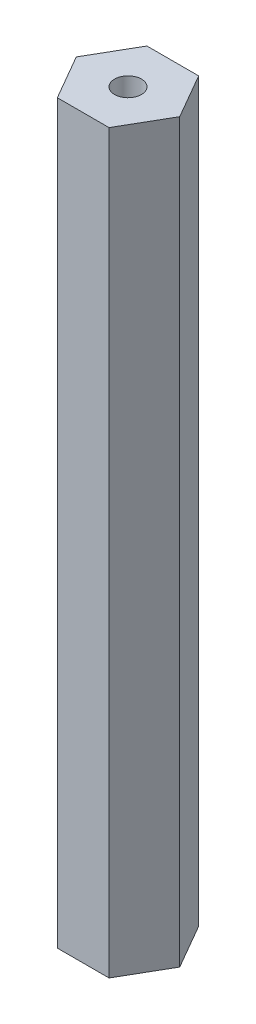
ISO-10303-21;
HEADER;
FILE_DESCRIPTION(('STEP AP214'),'2;1');
FILE_NAME('part.step','',(''),(''),'','','');
FILE_SCHEMA(('AUTOMOTIVE_DESIGN { 1 0 10303 214 1 1 1 1 }'));
ENDSEC;
DATA;
#1=APPLICATION_CONTEXT('core data for automotive mechanical design processes');
#2=APPLICATION_PROTOCOL_DEFINITION('international standard','automotive_design',2000,#1);
#3=PRODUCT_CONTEXT('',#1,'mechanical');
#4=PRODUCT('Part','Part','',(#3));
#5=PRODUCT_RELATED_PRODUCT_CATEGORY('part','',(#4));
#6=PRODUCT_DEFINITION_FORMATION('','',#4);
#7=PRODUCT_DEFINITION_CONTEXT('part definition',#1,'design');
#8=PRODUCT_DEFINITION('design','',#6,#7);
#9=PRODUCT_DEFINITION_SHAPE('','',#8);
#10=(LENGTH_UNIT() NAMED_UNIT(*) SI_UNIT(.MILLI.,.METRE.));
#11=(NAMED_UNIT(*) PLANE_ANGLE_UNIT() SI_UNIT($,.RADIAN.));
#12=(NAMED_UNIT(*) SI_UNIT($,.STERADIAN.) SOLID_ANGLE_UNIT());
#13=UNCERTAINTY_MEASURE_WITH_UNIT(LENGTH_MEASURE(1.E-05),#10,'distance_accuracy_value','');
#14=(GEOMETRIC_REPRESENTATION_CONTEXT(3) GLOBAL_UNCERTAINTY_ASSIGNED_CONTEXT((#13)) GLOBAL_UNIT_ASSIGNED_CONTEXT((#10,
#11,#12)) REPRESENTATION_CONTEXT('',''));
#15=CARTESIAN_POINT('',(0.,0.,0.));
#16=DIRECTION('',(0.,0.,1.));
#17=DIRECTION('',(1.,0.,0.));
#18=AXIS2_PLACEMENT_3D('',#15,#16,#17);
#19=CARTESIAN_POINT('',(1.44337567297409,41.1,2.49999999999997));
#20=DIRECTION('',(-0.866025403784441,0.,-0.499999999999995));
#21=DIRECTION('',(-0.499999999999995,0.,0.866025403784442));
#22=AXIS2_PLACEMENT_3D('',#19,#20,#21);
#23=PLANE('',#22);
#24=DIRECTION('',(0.499999999999995,0.,-0.866025403784442));
#25=VECTOR('',#24,1.);
#26=CARTESIAN_POINT('',(1.44337567297409,0.,2.49999999999997));
#27=LINE('',#26,#25);
#28=CARTESIAN_POINT('',(1.44337567297409,0.,2.49999999999997));
#29=VERTEX_POINT('',#28);
#30=CARTESIAN_POINT('',(2.88675134594812,0.,0.));
#31=VERTEX_POINT('',#30);
#32=EDGE_CURVE('E119',#29,#31,#27,.T.);
#33=ORIENTED_EDGE('',*,*,#32,.T.);
#34=DIRECTION('',(0.,-1.,0.));
#35=VECTOR('',#34,1.);
#36=CARTESIAN_POINT('',(2.88675134594812,41.1,0.));
#37=LINE('',#36,#35);
#38=CARTESIAN_POINT('',(2.88675134594812,41.1,0.));
#39=VERTEX_POINT('',#38);
#40=EDGE_CURVE('E11',#39,#31,#37,.T.);
#41=ORIENTED_EDGE('',*,*,#40,.F.);
#42=DIRECTION('',(0.499999999999995,0.,-0.866025403784442));
#43=VECTOR('',#42,1.);
#44=CARTESIAN_POINT('',(1.44337567297409,41.1,2.49999999999997));
#45=LINE('',#44,#43);
#46=CARTESIAN_POINT('',(1.44337567297409,41.1,2.49999999999997));
#47=VERTEX_POINT('',#46);
#48=EDGE_CURVE('E130',#47,#39,#45,.T.);
#49=ORIENTED_EDGE('',*,*,#48,.F.);
#50=DIRECTION('',(0.,-1.,0.));
#51=VECTOR('',#50,1.);
#52=CARTESIAN_POINT('',(1.44337567297409,41.1,2.49999999999997));
#53=LINE('',#52,#51);
#54=EDGE_CURVE('E115',#47,#29,#53,.T.);
#55=ORIENTED_EDGE('',*,*,#54,.T.);
#56=EDGE_LOOP('',(#33,#41,#49,#55));
#57=FACE_BOUND('',#56,.T.);
#58=ADVANCED_FACE('F35',(#57),#23,.F.);
#59=CARTESIAN_POINT('',(2.88675134594812,41.1,0.));
#60=DIRECTION('',(-0.866025403784438,0.,0.500000000000001));
#61=DIRECTION('',(0.500000000000001,0.,0.866025403784438));
#62=AXIS2_PLACEMENT_3D('',#59,#60,#61);
#63=PLANE('',#62);
#64=DIRECTION('',(-0.500000000000001,0.,-0.866025403784438));
#65=VECTOR('',#64,1.);
#66=CARTESIAN_POINT('',(2.88675134594812,0.,0.));
#67=LINE('',#66,#65);
#68=CARTESIAN_POINT('',(1.44337567297405,0.,-2.49999999999999));
#69=VERTEX_POINT('',#68);
#70=EDGE_CURVE('E122',#31,#69,#67,.T.);
#71=ORIENTED_EDGE('',*,*,#70,.T.);
#72=DIRECTION('',(0.,-1.,0.));
#73=VECTOR('',#72,1.);
#74=CARTESIAN_POINT('',(1.44337567297405,41.1,-2.49999999999999));
#75=LINE('',#74,#73);
#76=CARTESIAN_POINT('',(1.44337567297405,41.1,-2.49999999999999));
#77=VERTEX_POINT('',#76);
#78=EDGE_CURVE('E43',#77,#69,#75,.T.);
#79=ORIENTED_EDGE('',*,*,#78,.F.);
#80=DIRECTION('',(-0.500000000000001,0.,-0.866025403784438));
#81=VECTOR('',#80,1.);
#82=CARTESIAN_POINT('',(2.88675134594812,41.1,0.));
#83=LINE('',#82,#81);
#84=EDGE_CURVE('E88',#39,#77,#83,.T.);
#85=ORIENTED_EDGE('',*,*,#84,.F.);
#86=ORIENTED_EDGE('',*,*,#40,.T.);
#87=EDGE_LOOP('',(#71,#79,#85,#86));
#88=FACE_BOUND('',#87,.T.);
#89=ADVANCED_FACE('F155',(#88),#63,.F.);
#90=CARTESIAN_POINT('',(1.44337567297405,41.1,-2.49999999999999));
#91=DIRECTION('',(0.,0.,1.));
#92=DIRECTION('',(1.,0.,0.));
#93=AXIS2_PLACEMENT_3D('',#90,#91,#92);
#94=PLANE('',#93);
#95=DIRECTION('',(-1.,0.,0.));
#96=VECTOR('',#95,1.);
#97=CARTESIAN_POINT('',(1.44337567297405,0.,-2.49999999999999));
#98=LINE('',#97,#96);
#99=CARTESIAN_POINT('',(-1.44337567297407,0.,-2.49999999999998));
#100=VERTEX_POINT('',#99);
#101=EDGE_CURVE('E125',#69,#100,#98,.T.);
#102=ORIENTED_EDGE('',*,*,#101,.T.);
#103=DIRECTION('',(0.,-1.,0.));
#104=VECTOR('',#103,1.);
#105=CARTESIAN_POINT('',(-1.44337567297407,41.1,-2.49999999999998));
#106=LINE('',#105,#104);
#107=CARTESIAN_POINT('',(-1.44337567297407,41.1,-2.49999999999998));
#108=VERTEX_POINT('',#107);
#109=EDGE_CURVE('E110',#108,#100,#106,.T.);
#110=ORIENTED_EDGE('',*,*,#109,.F.);
#111=DIRECTION('',(-1.,0.,0.));
#112=VECTOR('',#111,1.);
#113=CARTESIAN_POINT('',(1.44337567297405,41.1,-2.49999999999999));
#114=LINE('',#113,#112);
#115=EDGE_CURVE('E101',#77,#108,#114,.T.);
#116=ORIENTED_EDGE('',*,*,#115,.F.);
#117=ORIENTED_EDGE('',*,*,#78,.T.);
#118=EDGE_LOOP('',(#102,#110,#116,#117));
#119=FACE_BOUND('',#118,.T.);
#120=ADVANCED_FACE('F136',(#119),#94,.F.);
#121=CARTESIAN_POINT('',(-1.44337567297407,41.1,-2.49999999999998));
#122=DIRECTION('',(0.866025403784441,0.,0.499999999999995));
#123=DIRECTION('',(0.499999999999995,0.,-0.866025403784442));
#124=AXIS2_PLACEMENT_3D('',#121,#122,#123);
#125=PLANE('',#124);
#126=DIRECTION('',(-0.499999999999995,0.,0.866025403784441));
#127=VECTOR('',#126,1.);
#128=CARTESIAN_POINT('',(-1.44337567297407,0.,-2.49999999999998));
#129=LINE('',#128,#127);
#130=CARTESIAN_POINT('',(-2.88675134594812,0.,0.));
#131=VERTEX_POINT('',#130);
#132=EDGE_CURVE('E109',#100,#131,#129,.T.);
#133=ORIENTED_EDGE('',*,*,#132,.T.);
#134=DIRECTION('',(0.,-1.,0.));
#135=VECTOR('',#134,1.);
#136=CARTESIAN_POINT('',(-2.88675134594812,41.1,0.));
#137=LINE('',#136,#135);
#138=CARTESIAN_POINT('',(-2.88675134594812,41.1,0.));
#139=VERTEX_POINT('',#138);
#140=EDGE_CURVE('E106',#139,#131,#137,.T.);
#141=ORIENTED_EDGE('',*,*,#140,.F.);
#142=DIRECTION('',(-0.499999999999995,0.,0.866025403784441));
#143=VECTOR('',#142,1.);
#144=CARTESIAN_POINT('',(-1.44337567297407,41.1,-2.49999999999998));
#145=LINE('',#144,#143);
#146=EDGE_CURVE('E95',#108,#139,#145,.T.);
#147=ORIENTED_EDGE('',*,*,#146,.F.);
#148=ORIENTED_EDGE('',*,*,#109,.T.);
#149=EDGE_LOOP('',(#133,#141,#147,#148));
#150=FACE_BOUND('',#149,.T.);
#151=ADVANCED_FACE('F107',(#150),#125,.F.);
#152=CARTESIAN_POINT('',(-2.88675134594812,41.1,0.));
#153=DIRECTION('',(0.866025403784435,0.,-0.500000000000007));
#154=DIRECTION('',(-0.500000000000007,0.,-0.866025403784435));
#155=AXIS2_PLACEMENT_3D('',#152,#153,#154);
#156=PLANE('',#155);
#157=DIRECTION('',(0.500000000000007,0.,0.866025403784435));
#158=VECTOR('',#157,1.);
#159=CARTESIAN_POINT('',(-2.88675134594812,0.,0.));
#160=LINE('',#159,#158);
#161=CARTESIAN_POINT('',(-1.44337567297404,0.,2.5));
#162=VERTEX_POINT('',#161);
#163=EDGE_CURVE('E74',#131,#162,#160,.T.);
#164=ORIENTED_EDGE('',*,*,#163,.T.);
#165=DIRECTION('',(0.,-1.,0.));
#166=VECTOR('',#165,1.);
#167=CARTESIAN_POINT('',(-1.44337567297404,41.1,2.5));
#168=LINE('',#167,#166);
#169=CARTESIAN_POINT('',(-1.44337567297404,41.1,2.5));
#170=VERTEX_POINT('',#169);
#171=EDGE_CURVE('E111',#170,#162,#168,.T.);
#172=ORIENTED_EDGE('',*,*,#171,.F.);
#173=DIRECTION('',(0.500000000000007,0.,0.866025403784435));
#174=VECTOR('',#173,1.);
#175=CARTESIAN_POINT('',(-2.88675134594812,41.1,0.));
#176=LINE('',#175,#174);
#177=EDGE_CURVE('E99',#139,#170,#176,.T.);
#178=ORIENTED_EDGE('',*,*,#177,.F.);
#179=ORIENTED_EDGE('',*,*,#140,.T.);
#180=EDGE_LOOP('',(#164,#172,#178,#179));
#181=FACE_BOUND('',#180,.T.);
#182=ADVANCED_FACE('F113',(#181),#156,.F.);
#183=CARTESIAN_POINT('',(-1.44337567297404,41.1,2.5));
#184=DIRECTION('',(0.,0.,-1.));
#185=DIRECTION('',(-1.,0.,0.));
#186=AXIS2_PLACEMENT_3D('',#183,#184,#185);
#187=PLANE('',#186);
#188=DIRECTION('',(1.,0.,0.));
#189=VECTOR('',#188,1.);
#190=CARTESIAN_POINT('',(-1.44337567297404,0.,2.5));
#191=LINE('',#190,#189);
#192=EDGE_CURVE('E80',#162,#29,#191,.T.);
#193=ORIENTED_EDGE('',*,*,#192,.T.);
#194=ORIENTED_EDGE('',*,*,#54,.F.);
#195=DIRECTION('',(1.,0.,0.));
#196=VECTOR('',#195,1.);
#197=CARTESIAN_POINT('',(-1.44337567297404,41.1,2.5));
#198=LINE('',#197,#196);
#199=EDGE_CURVE('E51',#170,#47,#198,.T.);
#200=ORIENTED_EDGE('',*,*,#199,.F.);
#201=ORIENTED_EDGE('',*,*,#171,.T.);
#202=EDGE_LOOP('',(#193,#194,#200,#201));
#203=FACE_BOUND('',#202,.T.);
#204=ADVANCED_FACE('F143',(#203),#187,.F.);
#205=CARTESIAN_POINT('',(0.,41.1,0.));
#206=DIRECTION('',(0.,1.,0.));
#207=DIRECTION('',(0.,0.,1.));
#208=AXIS2_PLACEMENT_3D('',#205,#206,#207);
#209=PLANE('',#208);
#210=CARTESIAN_POINT('',(0.,41.1,0.));
#211=DIRECTION('',(0.,1.,0.));
#212=DIRECTION('',(0.,0.,1.));
#213=AXIS2_PLACEMENT_3D('',#210,#211,#212);
#214=CIRCLE('',#213,0.75);
#215=CARTESIAN_POINT('',(0.,41.1,0.75));
#216=VERTEX_POINT('',#215);
#217=EDGE_CURVE('E210',#216,#216,#214,.T.);
#218=ORIENTED_EDGE('',*,*,#217,.F.);
#219=EDGE_LOOP('',(#218));
#220=FACE_BOUND('',#219,.T.);
#221=ORIENTED_EDGE('',*,*,#48,.T.);
#222=ORIENTED_EDGE('',*,*,#84,.T.);
#223=ORIENTED_EDGE('',*,*,#115,.T.);
#224=ORIENTED_EDGE('',*,*,#146,.T.);
#225=ORIENTED_EDGE('',*,*,#177,.T.);
#226=ORIENTED_EDGE('',*,*,#199,.T.);
#227=EDGE_LOOP('',(#221,#222,#223,#224,#225,#226));
#228=FACE_BOUND('',#227,.T.);
#229=ADVANCED_FACE('F97',(#220,#228),#209,.T.);
#230=CARTESIAN_POINT('',(0.,0.,0.));
#231=DIRECTION('',(0.,1.,0.));
#232=DIRECTION('',(0.,0.,1.));
#233=AXIS2_PLACEMENT_3D('',#230,#231,#232);
#234=PLANE('',#233);
#235=CARTESIAN_POINT('',(0.,0.,0.));
#236=DIRECTION('',(0.,1.,0.));
#237=DIRECTION('',(0.,0.,1.));
#238=AXIS2_PLACEMENT_3D('',#235,#236,#237);
#239=CIRCLE('',#238,0.75);
#240=CARTESIAN_POINT('',(0.,0.,0.75));
#241=VERTEX_POINT('',#240);
#242=EDGE_CURVE('E123',#241,#241,#239,.T.);
#243=ORIENTED_EDGE('',*,*,#242,.T.);
#244=EDGE_LOOP('',(#243));
#245=FACE_BOUND('',#244,.T.);
#246=ORIENTED_EDGE('',*,*,#32,.F.);
#247=ORIENTED_EDGE('',*,*,#192,.F.);
#248=ORIENTED_EDGE('',*,*,#163,.F.);
#249=ORIENTED_EDGE('',*,*,#132,.F.);
#250=ORIENTED_EDGE('',*,*,#101,.F.);
#251=ORIENTED_EDGE('',*,*,#70,.F.);
#252=EDGE_LOOP('',(#246,#247,#248,#249,#250,#251));
#253=FACE_BOUND('',#252,.T.);
#254=ADVANCED_FACE('F139',(#245,#253),#234,.F.);
#255=CARTESIAN_POINT('',(0.,0.,0.));
#256=DIRECTION('',(0.,1.,0.));
#257=DIRECTION('',(0.,0.,1.));
#258=AXIS2_PLACEMENT_3D('',#255,#256,#257);
#259=CYLINDRICAL_SURFACE('',#258,0.75);
#260=ORIENTED_EDGE('',*,*,#242,.F.);
#261=EDGE_LOOP('',(#260));
#262=FACE_BOUND('',#261,.T.);
#263=ORIENTED_EDGE('',*,*,#217,.T.);
#264=EDGE_LOOP('',(#263));
#265=FACE_BOUND('',#264,.T.);
#266=ADVANCED_FACE('F192',(#262,#265),#259,.F.);
#267=CLOSED_SHELL('',(#58,#89,#120,#151,#182,#204,#229,#254,#266));
#268=MANIFOLD_SOLID_BREP('B2',#267);
#269=ADVANCED_BREP_SHAPE_REPRESENTATION('',(#18,#268),#14);
#270=SHAPE_DEFINITION_REPRESENTATION(#9,#269);
ENDSEC;
END-ISO-10303-21;
